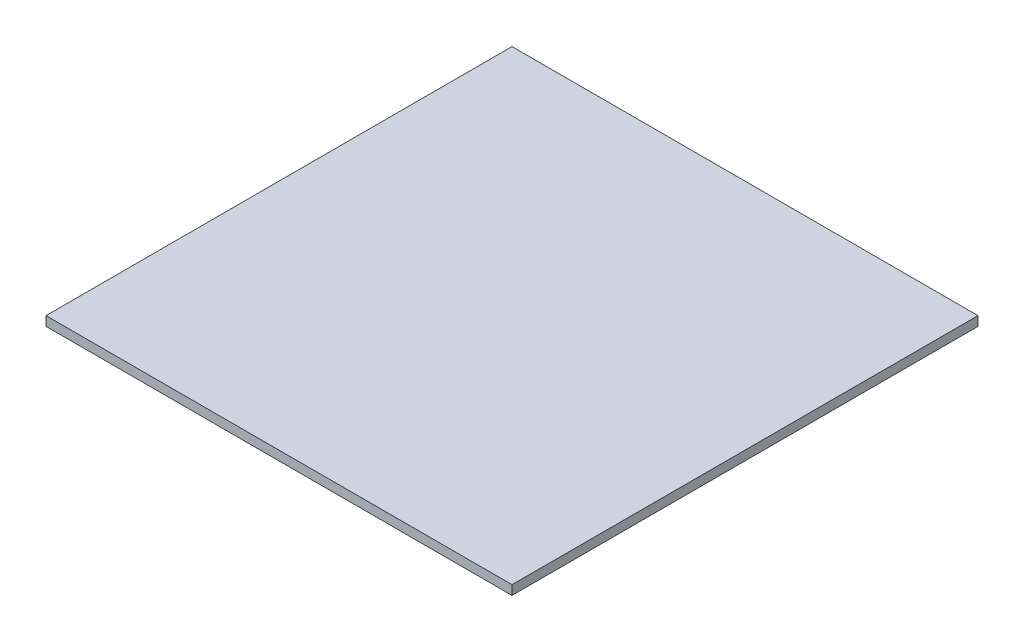
ISO-10303-21;
HEADER;
FILE_DESCRIPTION(('STEP AP214'),'2;1');
FILE_NAME('part.step','',(''),(''),'','','');
FILE_SCHEMA(('AUTOMOTIVE_DESIGN { 1 0 10303 214 1 1 1 1 }'));
ENDSEC;
DATA;
#1=APPLICATION_CONTEXT('core data for automotive mechanical design processes');
#2=APPLICATION_PROTOCOL_DEFINITION('international standard','automotive_design',2000,#1);
#3=PRODUCT_CONTEXT('',#1,'mechanical');
#4=PRODUCT('Part','Part','',(#3));
#5=PRODUCT_RELATED_PRODUCT_CATEGORY('part','',(#4));
#6=PRODUCT_DEFINITION_FORMATION('','',#4);
#7=PRODUCT_DEFINITION_CONTEXT('part definition',#1,'design');
#8=PRODUCT_DEFINITION('design','',#6,#7);
#9=PRODUCT_DEFINITION_SHAPE('','',#8);
#10=(LENGTH_UNIT() NAMED_UNIT(*) SI_UNIT(.MILLI.,.METRE.));
#11=(NAMED_UNIT(*) PLANE_ANGLE_UNIT() SI_UNIT($,.RADIAN.));
#12=(NAMED_UNIT(*) SI_UNIT($,.STERADIAN.) SOLID_ANGLE_UNIT());
#13=UNCERTAINTY_MEASURE_WITH_UNIT(LENGTH_MEASURE(1.E-05),#10,'distance_accuracy_value','');
#14=(GEOMETRIC_REPRESENTATION_CONTEXT(3) GLOBAL_UNCERTAINTY_ASSIGNED_CONTEXT((#13)) GLOBAL_UNIT_ASSIGNED_CONTEXT((#10,
#11,#12)) REPRESENTATION_CONTEXT('',''));
#15=CARTESIAN_POINT('',(0.,0.,0.));
#16=DIRECTION('',(0.,0.,1.));
#17=DIRECTION('',(1.,0.,0.));
#18=AXIS2_PLACEMENT_3D('',#15,#16,#17);
#19=CARTESIAN_POINT('',(250.,10.,250.));
#20=DIRECTION('',(-1.,0.,0.));
#21=DIRECTION('',(0.,0.,1.));
#22=AXIS2_PLACEMENT_3D('',#19,#20,#21);
#23=PLANE('',#22);
#24=DIRECTION('',(0.,0.,-1.));
#25=VECTOR('',#24,1.);
#26=CARTESIAN_POINT('',(250.,0.,250.));
#27=LINE('',#26,#25);
#28=CARTESIAN_POINT('',(250.,0.,250.));
#29=VERTEX_POINT('',#28);
#30=CARTESIAN_POINT('',(250.,0.,-250.));
#31=VERTEX_POINT('',#30);
#32=EDGE_CURVE('E104',#29,#31,#27,.T.);
#33=ORIENTED_EDGE('',*,*,#32,.T.);
#34=DIRECTION('',(0.,-1.,0.));
#35=VECTOR('',#34,1.);
#36=CARTESIAN_POINT('',(250.,10.,-250.));
#37=LINE('',#36,#35);
#38=CARTESIAN_POINT('',(250.,10.,-250.));
#39=VERTEX_POINT('',#38);
#40=EDGE_CURVE('E11',#39,#31,#37,.T.);
#41=ORIENTED_EDGE('',*,*,#40,.F.);
#42=DIRECTION('',(0.,0.,-1.));
#43=VECTOR('',#42,1.);
#44=CARTESIAN_POINT('',(250.,10.,250.));
#45=LINE('',#44,#43);
#46=CARTESIAN_POINT('',(250.,10.,250.));
#47=VERTEX_POINT('',#46);
#48=EDGE_CURVE('E92',#47,#39,#45,.T.);
#49=ORIENTED_EDGE('',*,*,#48,.F.);
#50=DIRECTION('',(0.,-1.,0.));
#51=VECTOR('',#50,1.);
#52=CARTESIAN_POINT('',(250.,10.,250.));
#53=LINE('',#52,#51);
#54=EDGE_CURVE('E100',#47,#29,#53,.T.);
#55=ORIENTED_EDGE('',*,*,#54,.T.);
#56=EDGE_LOOP('',(#33,#41,#49,#55));
#57=FACE_BOUND('',#56,.T.);
#58=ADVANCED_FACE('F41',(#57),#23,.F.);
#59=CARTESIAN_POINT('',(-250.,10.,-250.));
#60=DIRECTION('',(0.,0.,1.));
#61=DIRECTION('',(1.,0.,0.));
#62=AXIS2_PLACEMENT_3D('',#59,#60,#61);
#63=PLANE('',#62);
#64=DIRECTION('',(-1.,0.,0.));
#65=VECTOR('',#64,1.);
#66=CARTESIAN_POINT('',(-250.,0.,-250.));
#67=LINE('',#66,#65);
#68=CARTESIAN_POINT('',(-250.,0.,-250.));
#69=VERTEX_POINT('',#68);
#70=EDGE_CURVE('E96',#31,#69,#67,.T.);
#71=ORIENTED_EDGE('',*,*,#70,.T.);
#72=DIRECTION('',(0.,-1.,0.));
#73=VECTOR('',#72,1.);
#74=CARTESIAN_POINT('',(-250.,10.,-250.));
#75=LINE('',#74,#73);
#76=CARTESIAN_POINT('',(-250.,10.,-250.));
#77=VERTEX_POINT('',#76);
#78=EDGE_CURVE('E49',#77,#69,#75,.T.);
#79=ORIENTED_EDGE('',*,*,#78,.F.);
#80=DIRECTION('',(-1.,0.,0.));
#81=VECTOR('',#80,1.);
#82=CARTESIAN_POINT('',(-250.,10.,-250.));
#83=LINE('',#82,#81);
#84=EDGE_CURVE('E87',#39,#77,#83,.T.);
#85=ORIENTED_EDGE('',*,*,#84,.F.);
#86=ORIENTED_EDGE('',*,*,#40,.T.);
#87=EDGE_LOOP('',(#71,#79,#85,#86));
#88=FACE_BOUND('',#87,.T.);
#89=ADVANCED_FACE('F95',(#88),#63,.F.);
#90=CARTESIAN_POINT('',(-250.,10.,250.));
#91=DIRECTION('',(1.,0.,0.));
#92=DIRECTION('',(0.,0.,-1.));
#93=AXIS2_PLACEMENT_3D('',#90,#91,#92);
#94=PLANE('',#93);
#95=DIRECTION('',(0.,0.,1.));
#96=VECTOR('',#95,1.);
#97=CARTESIAN_POINT('',(-250.,0.,250.));
#98=LINE('',#97,#96);
#99=CARTESIAN_POINT('',(-250.,0.,250.));
#100=VERTEX_POINT('',#99);
#101=EDGE_CURVE('E74',#69,#100,#98,.T.);
#102=ORIENTED_EDGE('',*,*,#101,.T.);
#103=DIRECTION('',(0.,-1.,0.));
#104=VECTOR('',#103,1.);
#105=CARTESIAN_POINT('',(-250.,10.,250.));
#106=LINE('',#105,#104);
#107=CARTESIAN_POINT('',(-250.,10.,250.));
#108=VERTEX_POINT('',#107);
#109=EDGE_CURVE('E97',#108,#100,#106,.T.);
#110=ORIENTED_EDGE('',*,*,#109,.F.);
#111=DIRECTION('',(0.,0.,1.));
#112=VECTOR('',#111,1.);
#113=CARTESIAN_POINT('',(-250.,10.,250.));
#114=LINE('',#113,#112);
#115=EDGE_CURVE('E90',#77,#108,#114,.T.);
#116=ORIENTED_EDGE('',*,*,#115,.F.);
#117=ORIENTED_EDGE('',*,*,#78,.T.);
#118=EDGE_LOOP('',(#102,#110,#116,#117));
#119=FACE_BOUND('',#118,.T.);
#120=ADVANCED_FACE('F98',(#119),#94,.F.);
#121=CARTESIAN_POINT('',(-250.,10.,250.));
#122=DIRECTION('',(0.,0.,-1.));
#123=DIRECTION('',(-1.,0.,0.));
#124=AXIS2_PLACEMENT_3D('',#121,#122,#123);
#125=PLANE('',#124);
#126=DIRECTION('',(1.,0.,0.));
#127=VECTOR('',#126,1.);
#128=CARTESIAN_POINT('',(-250.,0.,250.));
#129=LINE('',#128,#127);
#130=EDGE_CURVE('E80',#100,#29,#129,.T.);
#131=ORIENTED_EDGE('',*,*,#130,.T.);
#132=ORIENTED_EDGE('',*,*,#54,.F.);
#133=DIRECTION('',(1.,0.,0.));
#134=VECTOR('',#133,1.);
#135=CARTESIAN_POINT('',(-250.,10.,250.));
#136=LINE('',#135,#134);
#137=EDGE_CURVE('E57',#108,#47,#136,.T.);
#138=ORIENTED_EDGE('',*,*,#137,.F.);
#139=ORIENTED_EDGE('',*,*,#109,.T.);
#140=EDGE_LOOP('',(#131,#132,#138,#139));
#141=FACE_BOUND('',#140,.T.);
#142=ADVANCED_FACE('F111',(#141),#125,.F.);
#143=CARTESIAN_POINT('',(0.,10.,0.));
#144=DIRECTION('',(0.,-1.,0.));
#145=DIRECTION('',(0.,0.,-1.));
#146=AXIS2_PLACEMENT_3D('',#143,#144,#145);
#147=PLANE('',#146);
#148=ORIENTED_EDGE('',*,*,#48,.T.);
#149=ORIENTED_EDGE('',*,*,#84,.T.);
#150=ORIENTED_EDGE('',*,*,#115,.T.);
#151=ORIENTED_EDGE('',*,*,#137,.T.);
#152=EDGE_LOOP('',(#148,#149,#150,#151));
#153=FACE_BOUND('',#152,.T.);
#154=ADVANCED_FACE('F88',(#153),#147,.F.);
#155=CARTESIAN_POINT('',(0.,0.,0.));
#156=DIRECTION('',(0.,-1.,0.));
#157=DIRECTION('',(0.,0.,-1.));
#158=AXIS2_PLACEMENT_3D('',#155,#156,#157);
#159=PLANE('',#158);
#160=ORIENTED_EDGE('',*,*,#32,.F.);
#161=ORIENTED_EDGE('',*,*,#130,.F.);
#162=ORIENTED_EDGE('',*,*,#101,.F.);
#163=ORIENTED_EDGE('',*,*,#70,.F.);
#164=EDGE_LOOP('',(#160,#161,#162,#163));
#165=FACE_BOUND('',#164,.T.);
#166=ADVANCED_FACE('F114',(#165),#159,.T.);
#167=CLOSED_SHELL('',(#58,#89,#120,#142,#154,#166));
#168=MANIFOLD_SOLID_BREP('B2',#167);
#169=ADVANCED_BREP_SHAPE_REPRESENTATION('',(#18,#168),#14);
#170=SHAPE_DEFINITION_REPRESENTATION(#9,#169);
ENDSEC;
END-ISO-10303-21;
